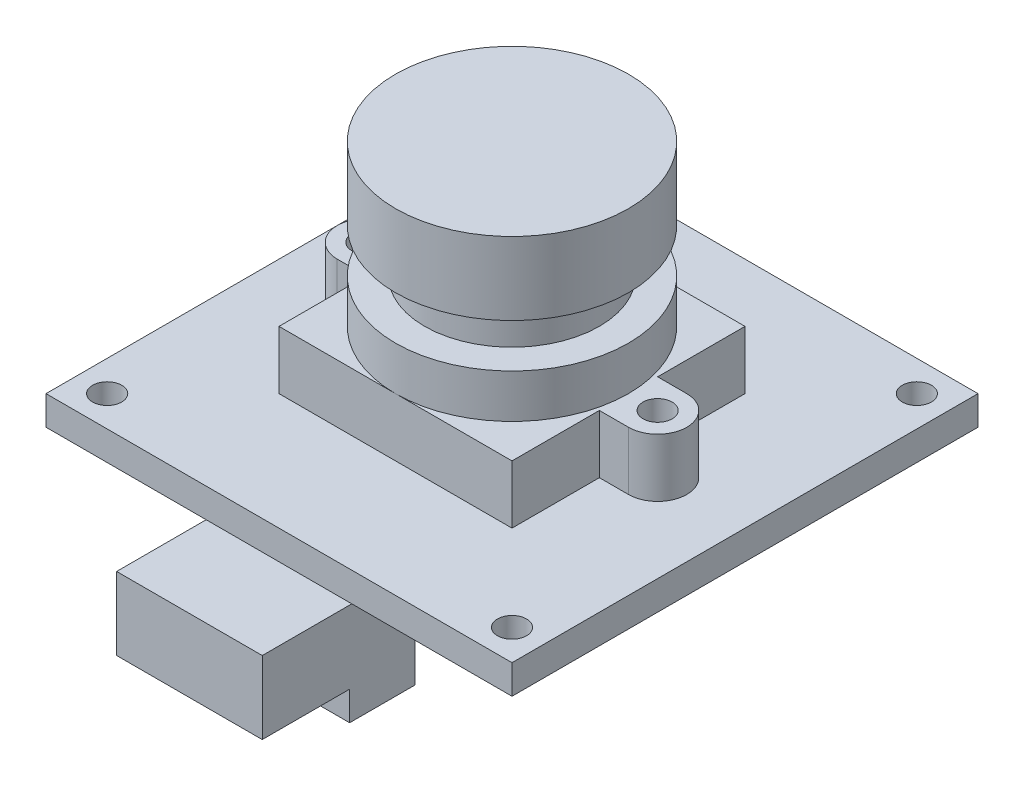
ISO-10303-21;
HEADER;
FILE_DESCRIPTION(('STEP AP214'),'2;1');
FILE_NAME('part.step','',(''),(''),'','','');
FILE_SCHEMA(('AUTOMOTIVE_DESIGN { 1 0 10303 214 1 1 1 1 }'));
ENDSEC;
DATA;
#1=APPLICATION_CONTEXT('core data for automotive mechanical design processes');
#2=APPLICATION_PROTOCOL_DEFINITION('international standard','automotive_design',2000,#1);
#3=PRODUCT_CONTEXT('',#1,'mechanical');
#4=PRODUCT('Part','Part','',(#3));
#5=PRODUCT_RELATED_PRODUCT_CATEGORY('part','',(#4));
#6=PRODUCT_DEFINITION_FORMATION('','',#4);
#7=PRODUCT_DEFINITION_CONTEXT('part definition',#1,'design');
#8=PRODUCT_DEFINITION('design','',#6,#7);
#9=PRODUCT_DEFINITION_SHAPE('','',#8);
#10=(LENGTH_UNIT() NAMED_UNIT(*) SI_UNIT(.MILLI.,.METRE.));
#11=(NAMED_UNIT(*) PLANE_ANGLE_UNIT() SI_UNIT($,.RADIAN.));
#12=(NAMED_UNIT(*) SI_UNIT($,.STERADIAN.) SOLID_ANGLE_UNIT());
#13=UNCERTAINTY_MEASURE_WITH_UNIT(LENGTH_MEASURE(1.E-05),#10,'distance_accuracy_value','');
#14=(GEOMETRIC_REPRESENTATION_CONTEXT(3) GLOBAL_UNCERTAINTY_ASSIGNED_CONTEXT((#13)) GLOBAL_UNIT_ASSIGNED_CONTEXT((#10,
#11,#12)) REPRESENTATION_CONTEXT('',''));
#15=CARTESIAN_POINT('',(0.,0.,0.));
#16=DIRECTION('',(0.,0.,1.));
#17=DIRECTION('',(1.,0.,0.));
#18=AXIS2_PLACEMENT_3D('',#15,#16,#17);
#19=CARTESIAN_POINT('',(-5.,-7.,16.15));
#20=DIRECTION('',(0.,0.,-1.));
#21=DIRECTION('',(-1.,0.,0.));
#22=AXIS2_PLACEMENT_3D('',#19,#20,#21);
#23=PLANE('',#22);
#24=DIRECTION('',(1.,0.,0.));
#25=VECTOR('',#24,1.);
#26=CARTESIAN_POINT('',(-5.,-5.,16.15));
#27=LINE('',#26,#25);
#28=CARTESIAN_POINT('',(-5.,-5.,16.15));
#29=VERTEX_POINT('',#28);
#30=CARTESIAN_POINT('',(5.,-5.,16.15));
#31=VERTEX_POINT('',#30);
#32=EDGE_CURVE('E63',#29,#31,#27,.T.);
#33=ORIENTED_EDGE('',*,*,#32,.F.);
#34=DIRECTION('',(0.,1.,0.));
#35=VECTOR('',#34,1.);
#36=CARTESIAN_POINT('',(-5.,-7.,16.15));
#37=LINE('',#36,#35);
#38=CARTESIAN_POINT('',(-5.,-7.,16.15));
#39=VERTEX_POINT('',#38);
#40=EDGE_CURVE('E232',#39,#29,#37,.T.);
#41=ORIENTED_EDGE('',*,*,#40,.F.);
#42=DIRECTION('',(-1.,0.,0.));
#43=VECTOR('',#42,1.);
#44=CARTESIAN_POINT('',(-5.,-7.,16.15));
#45=LINE('',#44,#43);
#46=CARTESIAN_POINT('',(5.,-7.,16.15));
#47=VERTEX_POINT('',#46);
#48=EDGE_CURVE('E245',#47,#39,#45,.T.);
#49=ORIENTED_EDGE('',*,*,#48,.F.);
#50=DIRECTION('',(0.,1.,0.));
#51=VECTOR('',#50,1.);
#52=CARTESIAN_POINT('',(5.,-7.,16.15));
#53=LINE('',#52,#51);
#54=EDGE_CURVE('E252',#47,#31,#53,.T.);
#55=ORIENTED_EDGE('',*,*,#54,.T.);
#56=EDGE_LOOP('',(#33,#41,#49,#55));
#57=FACE_BOUND('',#56,.T.);
#58=ADVANCED_FACE('F45',(#57),#23,.F.);
#59=CARTESIAN_POINT('',(0.,9.,0.));
#60=DIRECTION('',(0.,1.,0.));
#61=DIRECTION('',(0.,0.,1.));
#62=AXIS2_PLACEMENT_3D('',#59,#60,#61);
#63=PLANE('',#62);
#64=CARTESIAN_POINT('',(0.,9.,0.));
#65=DIRECTION('',(0.,1.,0.));
#66=DIRECTION('',(0.,0.,1.));
#67=AXIS2_PLACEMENT_3D('',#64,#65,#66);
#68=CIRCLE('',#67,8.);
#69=CARTESIAN_POINT('',(0.,9.,8.));
#70=VERTEX_POINT('',#69);
#71=EDGE_CURVE('E273',#70,#70,#68,.T.);
#72=ORIENTED_EDGE('',*,*,#71,.T.);
#73=EDGE_LOOP('',(#72));
#74=FACE_BOUND('',#73,.T.);
#75=CARTESIAN_POINT('',(0.,9.,0.));
#76=DIRECTION('',(0.,1.,0.));
#77=DIRECTION('',(0.,0.,1.));
#78=AXIS2_PLACEMENT_3D('',#75,#76,#77);
#79=CIRCLE('',#78,6.);
#80=CARTESIAN_POINT('',(0.,9.,6.));
#81=VERTEX_POINT('',#80);
#82=EDGE_CURVE('E264',#81,#81,#79,.T.);
#83=ORIENTED_EDGE('',*,*,#82,.F.);
#84=EDGE_LOOP('',(#83));
#85=FACE_BOUND('',#84,.T.);
#86=ADVANCED_FACE('F521',(#74,#85),#63,.T.);
#87=CARTESIAN_POINT('',(-10.,6.,0.));
#88=DIRECTION('',(0.,1.,0.));
#89=DIRECTION('',(0.,0.,1.));
#90=AXIS2_PLACEMENT_3D('',#87,#88,#89);
#91=PLANE('',#90);
#92=CARTESIAN_POINT('',(0.,6.,0.));
#93=DIRECTION('',(0.,1.,0.));
#94=DIRECTION('',(0.,0.,1.));
#95=AXIS2_PLACEMENT_3D('',#92,#93,#94);
#96=CIRCLE('',#95,8.);
#97=CARTESIAN_POINT('',(0.,6.,8.));
#98=VERTEX_POINT('',#97);
#99=CARTESIAN_POINT('',(0.,6.,-8.));
#100=VERTEX_POINT('',#99);
#101=EDGE_CURVE('E270',#98,#100,#96,.T.);
#102=ORIENTED_EDGE('',*,*,#101,.F.);
#103=DIRECTION('',(1.,0.,0.));
#104=VECTOR('',#103,1.);
#105=CARTESIAN_POINT('',(-8.,6.,8.));
#106=LINE('',#105,#104);
#107=CARTESIAN_POINT('',(8.,6.,8.));
#108=VERTEX_POINT('',#107);
#109=EDGE_CURVE('E309',#98,#108,#106,.T.);
#110=ORIENTED_EDGE('',*,*,#109,.T.);
#111=DIRECTION('',(0.,0.,-1.));
#112=VECTOR('',#111,1.);
#113=CARTESIAN_POINT('',(8.,6.,8.));
#114=LINE('',#113,#112);
#115=CARTESIAN_POINT('',(8.,6.,2.));
#116=VERTEX_POINT('',#115);
#117=EDGE_CURVE('E312',#108,#116,#114,.T.);
#118=ORIENTED_EDGE('',*,*,#117,.T.);
#119=DIRECTION('',(1.,0.,0.));
#120=VECTOR('',#119,1.);
#121=CARTESIAN_POINT('',(10.,6.,2.));
#122=LINE('',#121,#120);
#123=CARTESIAN_POINT('',(10.,6.,2.));
#124=VERTEX_POINT('',#123);
#125=EDGE_CURVE('E314',#116,#124,#122,.T.);
#126=ORIENTED_EDGE('',*,*,#125,.T.);
#127=CARTESIAN_POINT('',(10.,6.,0.));
#128=DIRECTION('',(0.,1.,0.));
#129=DIRECTION('',(0.,0.,1.));
#130=AXIS2_PLACEMENT_3D('',#127,#128,#129);
#131=CIRCLE('',#130,2.);
#132=CARTESIAN_POINT('',(10.,6.,-2.));
#133=VERTEX_POINT('',#132);
#134=EDGE_CURVE('E316',#124,#133,#131,.T.);
#135=ORIENTED_EDGE('',*,*,#134,.T.);
#136=DIRECTION('',(-1.,0.,0.));
#137=VECTOR('',#136,1.);
#138=CARTESIAN_POINT('',(10.,6.,-2.));
#139=LINE('',#138,#137);
#140=CARTESIAN_POINT('',(8.,6.,-2.));
#141=VERTEX_POINT('',#140);
#142=EDGE_CURVE('E318',#133,#141,#139,.T.);
#143=ORIENTED_EDGE('',*,*,#142,.T.);
#144=DIRECTION('',(0.,0.,-1.));
#145=VECTOR('',#144,1.);
#146=CARTESIAN_POINT('',(8.,6.,-2.));
#147=LINE('',#146,#145);
#148=CARTESIAN_POINT('',(8.,6.,-8.));
#149=VERTEX_POINT('',#148);
#150=EDGE_CURVE('E291',#141,#149,#147,.T.);
#151=ORIENTED_EDGE('',*,*,#150,.T.);
#152=DIRECTION('',(-1.,0.,0.));
#153=VECTOR('',#152,1.);
#154=CARTESIAN_POINT('',(-8.,6.,-8.));
#155=LINE('',#154,#153);
#156=EDGE_CURVE('E296',#149,#100,#155,.T.);
#157=ORIENTED_EDGE('',*,*,#156,.T.);
#158=EDGE_LOOP('',(#102,#110,#118,#126,#135,#143,#151,#157));
#159=FACE_BOUND('',#158,.T.);
#160=CARTESIAN_POINT('',(10.,6.,0.));
#161=DIRECTION('',(0.,1.,0.));
#162=DIRECTION('',(0.,0.,1.));
#163=AXIS2_PLACEMENT_3D('',#160,#161,#162);
#164=CIRCLE('',#163,1.);
#165=CARTESIAN_POINT('',(10.,6.,0.999999999999997));
#166=VERTEX_POINT('',#165);
#167=EDGE_CURVE('E285',#166,#166,#164,.T.);
#168=ORIENTED_EDGE('',*,*,#167,.F.);
#169=EDGE_LOOP('',(#168));
#170=FACE_BOUND('',#169,.T.);
#171=ADVANCED_FACE('F464',(#159,#170),#91,.T.);
#172=CARTESIAN_POINT('',(0.,2.,0.));
#173=DIRECTION('',(0.,-1.,0.));
#174=DIRECTION('',(0.,0.,-1.));
#175=AXIS2_PLACEMENT_3D('',#172,#173,#174);
#176=PLANE('',#175);
#177=CARTESIAN_POINT('',(13.9,2.,13.9));
#178=DIRECTION('',(0.,1.,0.));
#179=DIRECTION('',(0.,0.,1.));
#180=AXIS2_PLACEMENT_3D('',#177,#178,#179);
#181=CIRCLE('',#180,1.);
#182=CARTESIAN_POINT('',(13.9,2.,14.9));
#183=VERTEX_POINT('',#182);
#184=EDGE_CURVE('E391',#183,#183,#181,.T.);
#185=ORIENTED_EDGE('',*,*,#184,.F.);
#186=EDGE_LOOP('',(#185));
#187=FACE_BOUND('',#186,.T.);
#188=CARTESIAN_POINT('',(-13.9,2.,13.9));
#189=DIRECTION('',(0.,1.,0.));
#190=DIRECTION('',(0.,0.,1.));
#191=AXIS2_PLACEMENT_3D('',#188,#189,#190);
#192=CIRCLE('',#191,1.);
#193=CARTESIAN_POINT('',(-13.9,2.,14.9));
#194=VERTEX_POINT('',#193);
#195=EDGE_CURVE('E397',#194,#194,#192,.T.);
#196=ORIENTED_EDGE('',*,*,#195,.F.);
#197=EDGE_LOOP('',(#196));
#198=FACE_BOUND('',#197,.T.);
#199=CARTESIAN_POINT('',(13.9,2.,-13.9));
#200=DIRECTION('',(0.,1.,0.));
#201=DIRECTION('',(0.,0.,1.));
#202=AXIS2_PLACEMENT_3D('',#199,#200,#201);
#203=CIRCLE('',#202,1.);
#204=CARTESIAN_POINT('',(13.9,2.,-12.9));
#205=VERTEX_POINT('',#204);
#206=EDGE_CURVE('E403',#205,#205,#203,.T.);
#207=ORIENTED_EDGE('',*,*,#206,.F.);
#208=EDGE_LOOP('',(#207));
#209=FACE_BOUND('',#208,.T.);
#210=CARTESIAN_POINT('',(-13.9,2.,-13.9));
#211=DIRECTION('',(0.,1.,0.));
#212=DIRECTION('',(0.,0.,1.));
#213=AXIS2_PLACEMENT_3D('',#210,#211,#212);
#214=CIRCLE('',#213,1.);
#215=CARTESIAN_POINT('',(-13.9,2.,-12.9));
#216=VERTEX_POINT('',#215);
#217=EDGE_CURVE('E409',#216,#216,#214,.T.);
#218=ORIENTED_EDGE('',*,*,#217,.F.);
#219=EDGE_LOOP('',(#218));
#220=FACE_BOUND('',#219,.T.);
#221=DIRECTION('',(0.,0.,1.));
#222=VECTOR('',#221,1.);
#223=CARTESIAN_POINT('',(-16.,2.,16.));
#224=LINE('',#223,#222);
#225=CARTESIAN_POINT('',(-16.,2.,-16.));
#226=VERTEX_POINT('',#225);
#227=CARTESIAN_POINT('',(-16.,2.,16.));
#228=VERTEX_POINT('',#227);
#229=EDGE_CURVE('E415',#226,#228,#224,.T.);
#230=ORIENTED_EDGE('',*,*,#229,.T.);
#231=DIRECTION('',(1.,0.,0.));
#232=VECTOR('',#231,1.);
#233=CARTESIAN_POINT('',(-16.,2.,16.));
#234=LINE('',#233,#232);
#235=CARTESIAN_POINT('',(16.,2.,16.));
#236=VERTEX_POINT('',#235);
#237=EDGE_CURVE('E418',#228,#236,#234,.T.);
#238=ORIENTED_EDGE('',*,*,#237,.T.);
#239=DIRECTION('',(0.,0.,-1.));
#240=VECTOR('',#239,1.);
#241=CARTESIAN_POINT('',(16.,2.,16.));
#242=LINE('',#241,#240);
#243=CARTESIAN_POINT('',(16.,2.,-16.));
#244=VERTEX_POINT('',#243);
#245=EDGE_CURVE('E421',#236,#244,#242,.T.);
#246=ORIENTED_EDGE('',*,*,#245,.T.);
#247=DIRECTION('',(-1.,0.,0.));
#248=VECTOR('',#247,1.);
#249=CARTESIAN_POINT('',(-16.,2.,-16.));
#250=LINE('',#249,#248);
#251=EDGE_CURVE('E423',#244,#226,#250,.T.);
#252=ORIENTED_EDGE('',*,*,#251,.T.);
#253=EDGE_LOOP('',(#230,#238,#246,#252));
#254=FACE_BOUND('',#253,.T.);
#255=DIRECTION('',(0.,0.,-1.));
#256=VECTOR('',#255,1.);
#257=CARTESIAN_POINT('',(8.,2.,-2.));
#258=LINE('',#257,#256);
#259=CARTESIAN_POINT('',(8.,2.,-2.));
#260=VERTEX_POINT('',#259);
#261=CARTESIAN_POINT('',(8.,2.,-8.));
#262=VERTEX_POINT('',#261);
#263=EDGE_CURVE('E288',#260,#262,#258,.T.);
#264=ORIENTED_EDGE('',*,*,#263,.F.);
#265=DIRECTION('',(-1.,0.,0.));
#266=VECTOR('',#265,1.);
#267=CARTESIAN_POINT('',(10.,2.,-2.));
#268=LINE('',#267,#266);
#269=CARTESIAN_POINT('',(10.,2.,-2.));
#270=VERTEX_POINT('',#269);
#271=EDGE_CURVE('E295',#270,#260,#268,.T.);
#272=ORIENTED_EDGE('',*,*,#271,.F.);
#273=CARTESIAN_POINT('',(10.,2.,0.));
#274=DIRECTION('',(0.,1.,0.));
#275=DIRECTION('',(0.,0.,1.));
#276=AXIS2_PLACEMENT_3D('',#273,#274,#275);
#277=CIRCLE('',#276,2.);
#278=CARTESIAN_POINT('',(10.,2.,2.));
#279=VERTEX_POINT('',#278);
#280=EDGE_CURVE('E350',#279,#270,#277,.T.);
#281=ORIENTED_EDGE('',*,*,#280,.F.);
#282=DIRECTION('',(1.,0.,0.));
#283=VECTOR('',#282,1.);
#284=CARTESIAN_POINT('',(10.,2.,2.));
#285=LINE('',#284,#283);
#286=CARTESIAN_POINT('',(8.,2.,2.));
#287=VERTEX_POINT('',#286);
#288=EDGE_CURVE('E347',#287,#279,#285,.T.);
#289=ORIENTED_EDGE('',*,*,#288,.F.);
#290=DIRECTION('',(0.,0.,-1.));
#291=VECTOR('',#290,1.);
#292=CARTESIAN_POINT('',(8.,2.,8.));
#293=LINE('',#292,#291);
#294=CARTESIAN_POINT('',(8.,2.,8.));
#295=VERTEX_POINT('',#294);
#296=EDGE_CURVE('E344',#295,#287,#293,.T.);
#297=ORIENTED_EDGE('',*,*,#296,.F.);
#298=DIRECTION('',(1.,0.,0.));
#299=VECTOR('',#298,1.);
#300=CARTESIAN_POINT('',(-8.,2.,8.));
#301=LINE('',#300,#299);
#302=CARTESIAN_POINT('',(-8.,2.,8.));
#303=VERTEX_POINT('',#302);
#304=EDGE_CURVE('E341',#303,#295,#301,.T.);
#305=ORIENTED_EDGE('',*,*,#304,.F.);
#306=DIRECTION('',(0.,0.,1.));
#307=VECTOR('',#306,1.);
#308=CARTESIAN_POINT('',(-8.,2.,8.));
#309=LINE('',#308,#307);
#310=CARTESIAN_POINT('',(-8.,2.,2.));
#311=VERTEX_POINT('',#310);
#312=EDGE_CURVE('E338',#311,#303,#309,.T.);
#313=ORIENTED_EDGE('',*,*,#312,.F.);
#314=DIRECTION('',(1.,0.,0.));
#315=VECTOR('',#314,1.);
#316=CARTESIAN_POINT('',(-8.,2.,2.));
#317=LINE('',#316,#315);
#318=CARTESIAN_POINT('',(-10.,2.,2.));
#319=VERTEX_POINT('',#318);
#320=EDGE_CURVE('E335',#319,#311,#317,.T.);
#321=ORIENTED_EDGE('',*,*,#320,.F.);
#322=CARTESIAN_POINT('',(-10.,2.,0.));
#323=DIRECTION('',(0.,1.,0.));
#324=DIRECTION('',(0.,0.,1.));
#325=AXIS2_PLACEMENT_3D('',#322,#323,#324);
#326=CIRCLE('',#325,2.);
#327=CARTESIAN_POINT('',(-10.,2.,-2.));
#328=VERTEX_POINT('',#327);
#329=EDGE_CURVE('E332',#328,#319,#326,.T.);
#330=ORIENTED_EDGE('',*,*,#329,.F.);
#331=DIRECTION('',(-1.,0.,0.));
#332=VECTOR('',#331,1.);
#333=CARTESIAN_POINT('',(-8.,2.,-2.));
#334=LINE('',#333,#332);
#335=CARTESIAN_POINT('',(-8.,2.,-2.));
#336=VERTEX_POINT('',#335);
#337=EDGE_CURVE('E329',#336,#328,#334,.T.);
#338=ORIENTED_EDGE('',*,*,#337,.F.);
#339=DIRECTION('',(0.,0.,1.));
#340=VECTOR('',#339,1.);
#341=CARTESIAN_POINT('',(-8.,2.,-2.));
#342=LINE('',#341,#340);
#343=CARTESIAN_POINT('',(-8.,2.,-8.));
#344=VERTEX_POINT('',#343);
#345=EDGE_CURVE('E326',#344,#336,#342,.T.);
#346=ORIENTED_EDGE('',*,*,#345,.F.);
#347=DIRECTION('',(-1.,0.,0.));
#348=VECTOR('',#347,1.);
#349=CARTESIAN_POINT('',(-8.,2.,-8.));
#350=LINE('',#349,#348);
#351=EDGE_CURVE('E323',#262,#344,#350,.T.);
#352=ORIENTED_EDGE('',*,*,#351,.F.);
#353=EDGE_LOOP('',(#264,#272,#281,#289,#297,#305,#313,#321,#330,#338,#346,#352));
#354=FACE_BOUND('',#353,.T.);
#355=ADVANCED_FACE('F509',(#187,#198,#209,#220,#254,#354),#176,.F.);
#356=CARTESIAN_POINT('',(0.,0.,0.));
#357=DIRECTION('',(0.,-1.,0.));
#358=DIRECTION('',(0.,0.,-1.));
#359=AXIS2_PLACEMENT_3D('',#356,#357,#358);
#360=PLANE('',#359);
#361=DIRECTION('',(0.,0.,-1.));
#362=VECTOR('',#361,1.);
#363=CARTESIAN_POINT('',(-5.,0.,16.15));
#364=LINE('',#363,#362);
#365=CARTESIAN_POINT('',(-5.,0.,16.));
#366=VERTEX_POINT('',#365);
#367=CARTESIAN_POINT('',(-5.,0.,11.65));
#368=VERTEX_POINT('',#367);
#369=EDGE_CURVE('E11',#366,#368,#364,.T.);
#370=ORIENTED_EDGE('',*,*,#369,.F.);
#371=DIRECTION('',(1.,0.,0.));
#372=VECTOR('',#371,1.);
#373=CARTESIAN_POINT('',(-16.,0.,16.));
#374=LINE('',#373,#372);
#375=CARTESIAN_POINT('',(-16.,0.,16.));
#376=VERTEX_POINT('',#375);
#377=EDGE_CURVE('E429',#376,#366,#374,.T.);
#378=ORIENTED_EDGE('',*,*,#377,.F.);
#379=DIRECTION('',(0.,0.,1.));
#380=VECTOR('',#379,1.);
#381=CARTESIAN_POINT('',(-16.,0.,16.));
#382=LINE('',#381,#380);
#383=CARTESIAN_POINT('',(-16.,0.,-16.));
#384=VERTEX_POINT('',#383);
#385=EDGE_CURVE('E412',#384,#376,#382,.T.);
#386=ORIENTED_EDGE('',*,*,#385,.F.);
#387=DIRECTION('',(-1.,0.,0.));
#388=VECTOR('',#387,1.);
#389=CARTESIAN_POINT('',(-16.,0.,-16.));
#390=LINE('',#389,#388);
#391=CARTESIAN_POINT('',(16.,0.,-16.));
#392=VERTEX_POINT('',#391);
#393=EDGE_CURVE('E419',#392,#384,#390,.T.);
#394=ORIENTED_EDGE('',*,*,#393,.F.);
#395=DIRECTION('',(0.,0.,-1.));
#396=VECTOR('',#395,1.);
#397=CARTESIAN_POINT('',(16.,0.,16.));
#398=LINE('',#397,#396);
#399=CARTESIAN_POINT('',(16.,0.,16.));
#400=VERTEX_POINT('',#399);
#401=EDGE_CURVE('E432',#400,#392,#398,.T.);
#402=ORIENTED_EDGE('',*,*,#401,.F.);
#403=CARTESIAN_POINT('',(5.,0.,16.));
#404=VERTEX_POINT('',#403);
#405=EDGE_CURVE('E428',#404,#400,#374,.T.);
#406=ORIENTED_EDGE('',*,*,#405,.F.);
#407=DIRECTION('',(0.,0.,1.));
#408=VECTOR('',#407,1.);
#409=CARTESIAN_POINT('',(5.,0.,16.15));
#410=LINE('',#409,#408);
#411=CARTESIAN_POINT('',(5.,0.,11.65));
#412=VERTEX_POINT('',#411);
#413=EDGE_CURVE('E241',#412,#404,#410,.T.);
#414=ORIENTED_EDGE('',*,*,#413,.F.);
#415=DIRECTION('',(1.,0.,0.));
#416=VECTOR('',#415,1.);
#417=CARTESIAN_POINT('',(-5.,0.,11.65));
#418=LINE('',#417,#416);
#419=EDGE_CURVE('E71',#368,#412,#418,.T.);
#420=ORIENTED_EDGE('',*,*,#419,.F.);
#421=EDGE_LOOP('',(#370,#378,#386,#394,#402,#406,#414,#420));
#422=FACE_BOUND('',#421,.T.);
#423=CARTESIAN_POINT('',(-13.9,0.,13.9));
#424=DIRECTION('',(0.,1.,0.));
#425=DIRECTION('',(0.,0.,1.));
#426=AXIS2_PLACEMENT_3D('',#423,#424,#425);
#427=CIRCLE('',#426,1.);
#428=CARTESIAN_POINT('',(-13.9,0.,14.9));
#429=VERTEX_POINT('',#428);
#430=EDGE_CURVE('E394',#429,#429,#427,.T.);
#431=ORIENTED_EDGE('',*,*,#430,.T.);
#432=EDGE_LOOP('',(#431));
#433=FACE_BOUND('',#432,.T.);
#434=CARTESIAN_POINT('',(-13.9,0.,-13.9));
#435=DIRECTION('',(0.,1.,0.));
#436=DIRECTION('',(0.,0.,1.));
#437=AXIS2_PLACEMENT_3D('',#434,#435,#436);
#438=CIRCLE('',#437,1.);
#439=CARTESIAN_POINT('',(-13.9,0.,-12.9));
#440=VERTEX_POINT('',#439);
#441=EDGE_CURVE('E406',#440,#440,#438,.T.);
#442=ORIENTED_EDGE('',*,*,#441,.T.);
#443=EDGE_LOOP('',(#442));
#444=FACE_BOUND('',#443,.T.);
#445=CARTESIAN_POINT('',(13.9,0.,-13.9));
#446=DIRECTION('',(0.,1.,0.));
#447=DIRECTION('',(0.,0.,1.));
#448=AXIS2_PLACEMENT_3D('',#445,#446,#447);
#449=CIRCLE('',#448,1.);
#450=CARTESIAN_POINT('',(13.9,0.,-12.9));
#451=VERTEX_POINT('',#450);
#452=EDGE_CURVE('E400',#451,#451,#449,.T.);
#453=ORIENTED_EDGE('',*,*,#452,.T.);
#454=EDGE_LOOP('',(#453));
#455=FACE_BOUND('',#454,.T.);
#456=CARTESIAN_POINT('',(13.9,0.,13.9));
#457=DIRECTION('',(0.,1.,0.));
#458=DIRECTION('',(0.,0.,1.));
#459=AXIS2_PLACEMENT_3D('',#456,#457,#458);
#460=CIRCLE('',#459,1.);
#461=CARTESIAN_POINT('',(13.9,0.,14.9));
#462=VERTEX_POINT('',#461);
#463=EDGE_CURVE('E390',#462,#462,#460,.T.);
#464=ORIENTED_EDGE('',*,*,#463,.T.);
#465=EDGE_LOOP('',(#464));
#466=FACE_BOUND('',#465,.T.);
#467=ADVANCED_FACE('F511',(#422,#433,#444,#455,#466),#360,.T.);
#468=CARTESIAN_POINT('',(-16.,2.,16.));
#469=DIRECTION('',(1.,0.,0.));
#470=DIRECTION('',(0.,0.,-1.));
#471=AXIS2_PLACEMENT_3D('',#468,#469,#470);
#472=PLANE('',#471);
#473=ORIENTED_EDGE('',*,*,#385,.T.);
#474=DIRECTION('',(0.,-1.,0.));
#475=VECTOR('',#474,1.);
#476=CARTESIAN_POINT('',(-16.,2.,16.));
#477=LINE('',#476,#475);
#478=EDGE_CURVE('E49',#228,#376,#477,.T.);
#479=ORIENTED_EDGE('',*,*,#478,.F.);
#480=ORIENTED_EDGE('',*,*,#229,.F.);
#481=DIRECTION('',(0.,-1.,0.));
#482=VECTOR('',#481,1.);
#483=CARTESIAN_POINT('',(-16.,2.,-16.));
#484=LINE('',#483,#482);
#485=EDGE_CURVE('E425',#226,#384,#484,.T.);
#486=ORIENTED_EDGE('',*,*,#485,.T.);
#487=EDGE_LOOP('',(#473,#479,#480,#486));
#488=FACE_BOUND('',#487,.T.);
#489=ADVANCED_FACE('F47',(#488),#472,.F.);
#490=CARTESIAN_POINT('',(-16.,2.,16.));
#491=DIRECTION('',(0.,0.,-1.));
#492=DIRECTION('',(-1.,0.,0.));
#493=AXIS2_PLACEMENT_3D('',#490,#491,#492);
#494=PLANE('',#493);
#495=ORIENTED_EDGE('',*,*,#377,.T.);
#496=EDGE_CURVE('E433',#366,#404,#374,.T.);
#497=ORIENTED_EDGE('',*,*,#496,.T.);
#498=ORIENTED_EDGE('',*,*,#405,.T.);
#499=DIRECTION('',(0.,-1.,0.));
#500=VECTOR('',#499,1.);
#501=CARTESIAN_POINT('',(16.,2.,16.));
#502=LINE('',#501,#500);
#503=EDGE_CURVE('E440',#236,#400,#502,.T.);
#504=ORIENTED_EDGE('',*,*,#503,.F.);
#505=ORIENTED_EDGE('',*,*,#237,.F.);
#506=ORIENTED_EDGE('',*,*,#478,.T.);
#507=EDGE_LOOP('',(#495,#497,#498,#504,#505,#506));
#508=FACE_BOUND('',#507,.T.);
#509=ADVANCED_FACE('F648',(#508),#494,.F.);
#510=CARTESIAN_POINT('',(16.,2.,16.));
#511=DIRECTION('',(-1.,0.,0.));
#512=DIRECTION('',(0.,0.,1.));
#513=AXIS2_PLACEMENT_3D('',#510,#511,#512);
#514=PLANE('',#513);
#515=ORIENTED_EDGE('',*,*,#401,.T.);
#516=DIRECTION('',(0.,-1.,0.));
#517=VECTOR('',#516,1.);
#518=CARTESIAN_POINT('',(16.,2.,-16.));
#519=LINE('',#518,#517);
#520=EDGE_CURVE('E438',#244,#392,#519,.T.);
#521=ORIENTED_EDGE('',*,*,#520,.F.);
#522=ORIENTED_EDGE('',*,*,#245,.F.);
#523=ORIENTED_EDGE('',*,*,#503,.T.);
#524=EDGE_LOOP('',(#515,#521,#522,#523));
#525=FACE_BOUND('',#524,.T.);
#526=ADVANCED_FACE('F624',(#525),#514,.F.);
#527=CARTESIAN_POINT('',(-16.,2.,-16.));
#528=DIRECTION('',(0.,0.,1.));
#529=DIRECTION('',(1.,0.,0.));
#530=AXIS2_PLACEMENT_3D('',#527,#528,#529);
#531=PLANE('',#530);
#532=ORIENTED_EDGE('',*,*,#393,.T.);
#533=ORIENTED_EDGE('',*,*,#485,.F.);
#534=ORIENTED_EDGE('',*,*,#251,.F.);
#535=ORIENTED_EDGE('',*,*,#520,.T.);
#536=EDGE_LOOP('',(#532,#533,#534,#535));
#537=FACE_BOUND('',#536,.T.);
#538=ADVANCED_FACE('F619',(#537),#531,.F.);
#539=CARTESIAN_POINT('',(-13.9,2.,-13.9));
#540=DIRECTION('',(0.,-1.,0.));
#541=DIRECTION('',(0.,0.,-1.));
#542=AXIS2_PLACEMENT_3D('',#539,#540,#541);
#543=CYLINDRICAL_SURFACE('',#542,1.);
#544=ORIENTED_EDGE('',*,*,#217,.T.);
#545=EDGE_LOOP('',(#544));
#546=FACE_BOUND('',#545,.T.);
#547=ORIENTED_EDGE('',*,*,#441,.F.);
#548=EDGE_LOOP('',(#547));
#549=FACE_BOUND('',#548,.T.);
#550=ADVANCED_FACE('F616',(#546,#549),#543,.F.);
#551=CARTESIAN_POINT('',(13.9,2.,-13.9));
#552=DIRECTION('',(0.,-1.,0.));
#553=DIRECTION('',(0.,0.,-1.));
#554=AXIS2_PLACEMENT_3D('',#551,#552,#553);
#555=CYLINDRICAL_SURFACE('',#554,1.);
#556=ORIENTED_EDGE('',*,*,#206,.T.);
#557=EDGE_LOOP('',(#556));
#558=FACE_BOUND('',#557,.T.);
#559=ORIENTED_EDGE('',*,*,#452,.F.);
#560=EDGE_LOOP('',(#559));
#561=FACE_BOUND('',#560,.T.);
#562=ADVANCED_FACE('F613',(#558,#561),#555,.F.);
#563=CARTESIAN_POINT('',(-13.9,2.,13.9));
#564=DIRECTION('',(0.,-1.,0.));
#565=DIRECTION('',(0.,0.,-1.));
#566=AXIS2_PLACEMENT_3D('',#563,#564,#565);
#567=CYLINDRICAL_SURFACE('',#566,1.);
#568=ORIENTED_EDGE('',*,*,#195,.T.);
#569=EDGE_LOOP('',(#568));
#570=FACE_BOUND('',#569,.T.);
#571=ORIENTED_EDGE('',*,*,#430,.F.);
#572=EDGE_LOOP('',(#571));
#573=FACE_BOUND('',#572,.T.);
#574=ADVANCED_FACE('F609',(#570,#573),#567,.F.);
#575=CARTESIAN_POINT('',(13.9,2.,13.9));
#576=DIRECTION('',(0.,-1.,0.));
#577=DIRECTION('',(0.,0.,-1.));
#578=AXIS2_PLACEMENT_3D('',#575,#576,#577);
#579=CYLINDRICAL_SURFACE('',#578,1.);
#580=ORIENTED_EDGE('',*,*,#184,.T.);
#581=EDGE_LOOP('',(#580));
#582=FACE_BOUND('',#581,.T.);
#583=ORIENTED_EDGE('',*,*,#463,.F.);
#584=EDGE_LOOP('',(#583));
#585=FACE_BOUND('',#584,.T.);
#586=ADVANCED_FACE('F582',(#582,#585),#579,.F.);
#587=EDGE_CURVE('E54',#100,#98,#96,.T.);
#588=ORIENTED_EDGE('',*,*,#587,.F.);
#589=CARTESIAN_POINT('',(-8.,6.,-8.));
#590=VERTEX_POINT('',#589);
#591=EDGE_CURVE('E294',#100,#590,#155,.T.);
#592=ORIENTED_EDGE('',*,*,#591,.T.);
#593=DIRECTION('',(0.,0.,1.));
#594=VECTOR('',#593,1.);
#595=CARTESIAN_POINT('',(-8.,6.,-2.));
#596=LINE('',#595,#594);
#597=CARTESIAN_POINT('',(-8.,6.,-2.));
#598=VERTEX_POINT('',#597);
#599=EDGE_CURVE('E299',#590,#598,#596,.T.);
#600=ORIENTED_EDGE('',*,*,#599,.T.);
#601=DIRECTION('',(-1.,0.,0.));
#602=VECTOR('',#601,1.);
#603=CARTESIAN_POINT('',(-8.,6.,-2.));
#604=LINE('',#603,#602);
#605=CARTESIAN_POINT('',(-10.,6.,-2.));
#606=VERTEX_POINT('',#605);
#607=EDGE_CURVE('E301',#598,#606,#604,.T.);
#608=ORIENTED_EDGE('',*,*,#607,.T.);
#609=CARTESIAN_POINT('',(-10.,6.,0.));
#610=DIRECTION('',(0.,1.,0.));
#611=DIRECTION('',(0.,0.,1.));
#612=AXIS2_PLACEMENT_3D('',#609,#610,#611);
#613=CIRCLE('',#612,2.);
#614=CARTESIAN_POINT('',(-10.,6.,2.));
#615=VERTEX_POINT('',#614);
#616=EDGE_CURVE('E303',#606,#615,#613,.T.);
#617=ORIENTED_EDGE('',*,*,#616,.T.);
#618=DIRECTION('',(1.,0.,0.));
#619=VECTOR('',#618,1.);
#620=CARTESIAN_POINT('',(-8.,6.,2.));
#621=LINE('',#620,#619);
#622=CARTESIAN_POINT('',(-8.,6.,2.));
#623=VERTEX_POINT('',#622);
#624=EDGE_CURVE('E305',#615,#623,#621,.T.);
#625=ORIENTED_EDGE('',*,*,#624,.T.);
#626=DIRECTION('',(0.,0.,1.));
#627=VECTOR('',#626,1.);
#628=CARTESIAN_POINT('',(-8.,6.,8.));
#629=LINE('',#628,#627);
#630=CARTESIAN_POINT('',(-8.,6.,8.));
#631=VERTEX_POINT('',#630);
#632=EDGE_CURVE('E307',#623,#631,#629,.T.);
#633=ORIENTED_EDGE('',*,*,#632,.T.);
#634=EDGE_CURVE('E310',#631,#98,#106,.T.);
#635=ORIENTED_EDGE('',*,*,#634,.T.);
#636=EDGE_LOOP('',(#588,#592,#600,#608,#617,#625,#633,#635));
#637=FACE_BOUND('',#636,.T.);
#638=CARTESIAN_POINT('',(-10.,6.,0.));
#639=DIRECTION('',(0.,1.,0.));
#640=DIRECTION('',(0.,0.,1.));
#641=AXIS2_PLACEMENT_3D('',#638,#639,#640);
#642=CIRCLE('',#641,1.);
#643=CARTESIAN_POINT('',(-10.,6.,1.));
#644=VERTEX_POINT('',#643);
#645=EDGE_CURVE('E279',#644,#644,#642,.T.);
#646=ORIENTED_EDGE('',*,*,#645,.F.);
#647=EDGE_LOOP('',(#646));
#648=FACE_BOUND('',#647,.T.);
#649=ADVANCED_FACE('F455',(#637,#648),#91,.T.);
#650=CARTESIAN_POINT('',(8.,6.,-2.));
#651=DIRECTION('',(-1.,0.,0.));
#652=DIRECTION('',(0.,0.,1.));
#653=AXIS2_PLACEMENT_3D('',#650,#651,#652);
#654=PLANE('',#653);
#655=ORIENTED_EDGE('',*,*,#263,.T.);
#656=DIRECTION('',(0.,-1.,0.));
#657=VECTOR('',#656,1.);
#658=CARTESIAN_POINT('',(8.,6.,-8.));
#659=LINE('',#658,#657);
#660=EDGE_CURVE('E387',#149,#262,#659,.T.);
#661=ORIENTED_EDGE('',*,*,#660,.F.);
#662=ORIENTED_EDGE('',*,*,#150,.F.);
#663=DIRECTION('',(0.,-1.,0.));
#664=VECTOR('',#663,1.);
#665=CARTESIAN_POINT('',(8.,6.,-2.));
#666=LINE('',#665,#664);
#667=EDGE_CURVE('E320',#141,#260,#666,.T.);
#668=ORIENTED_EDGE('',*,*,#667,.T.);
#669=EDGE_LOOP('',(#655,#661,#662,#668));
#670=FACE_BOUND('',#669,.T.);
#671=ADVANCED_FACE('F471',(#670),#654,.F.);
#672=CARTESIAN_POINT('',(-8.,6.,-8.));
#673=DIRECTION('',(0.,0.,1.));
#674=DIRECTION('',(1.,0.,0.));
#675=AXIS2_PLACEMENT_3D('',#672,#673,#674);
#676=PLANE('',#675);
#677=ORIENTED_EDGE('',*,*,#351,.T.);
#678=DIRECTION('',(0.,-1.,0.));
#679=VECTOR('',#678,1.);
#680=CARTESIAN_POINT('',(-8.,6.,-8.));
#681=LINE('',#680,#679);
#682=EDGE_CURVE('E384',#590,#344,#681,.T.);
#683=ORIENTED_EDGE('',*,*,#682,.F.);
#684=ORIENTED_EDGE('',*,*,#591,.F.);
#685=ORIENTED_EDGE('',*,*,#156,.F.);
#686=ORIENTED_EDGE('',*,*,#660,.T.);
#687=EDGE_LOOP('',(#677,#683,#684,#685,#686));
#688=FACE_BOUND('',#687,.T.);
#689=ADVANCED_FACE('F461',(#688),#676,.F.);
#690=CARTESIAN_POINT('',(-8.,6.,-2.));
#691=DIRECTION('',(1.,0.,0.));
#692=DIRECTION('',(0.,0.,-1.));
#693=AXIS2_PLACEMENT_3D('',#690,#691,#692);
#694=PLANE('',#693);
#695=ORIENTED_EDGE('',*,*,#345,.T.);
#696=DIRECTION('',(0.,-1.,0.));
#697=VECTOR('',#696,1.);
#698=CARTESIAN_POINT('',(-8.,6.,-2.));
#699=LINE('',#698,#697);
#700=EDGE_CURVE('E381',#598,#336,#699,.T.);
#701=ORIENTED_EDGE('',*,*,#700,.F.);
#702=ORIENTED_EDGE('',*,*,#599,.F.);
#703=ORIENTED_EDGE('',*,*,#682,.T.);
#704=EDGE_LOOP('',(#695,#701,#702,#703));
#705=FACE_BOUND('',#704,.T.);
#706=ADVANCED_FACE('F474',(#705),#694,.F.);
#707=CARTESIAN_POINT('',(-8.,6.,-2.));
#708=DIRECTION('',(0.,0.,1.));
#709=DIRECTION('',(1.,0.,0.));
#710=AXIS2_PLACEMENT_3D('',#707,#708,#709);
#711=PLANE('',#710);
#712=ORIENTED_EDGE('',*,*,#337,.T.);
#713=DIRECTION('',(0.,-1.,0.));
#714=VECTOR('',#713,1.);
#715=CARTESIAN_POINT('',(-10.,6.,-2.));
#716=LINE('',#715,#714);
#717=EDGE_CURVE('E378',#606,#328,#716,.T.);
#718=ORIENTED_EDGE('',*,*,#717,.F.);
#719=ORIENTED_EDGE('',*,*,#607,.F.);
#720=ORIENTED_EDGE('',*,*,#700,.T.);
#721=EDGE_LOOP('',(#712,#718,#719,#720));
#722=FACE_BOUND('',#721,.T.);
#723=ADVANCED_FACE('F481',(#722),#711,.F.);
#724=CARTESIAN_POINT('',(-10.,6.,0.));
#725=DIRECTION('',(0.,-1.,0.));
#726=DIRECTION('',(0.,0.,-1.));
#727=AXIS2_PLACEMENT_3D('',#724,#725,#726);
#728=CYLINDRICAL_SURFACE('',#727,2.);
#729=ORIENTED_EDGE('',*,*,#329,.T.);
#730=DIRECTION('',(0.,-1.,0.));
#731=VECTOR('',#730,1.);
#732=CARTESIAN_POINT('',(-10.,6.,2.));
#733=LINE('',#732,#731);
#734=EDGE_CURVE('E375',#615,#319,#733,.T.);
#735=ORIENTED_EDGE('',*,*,#734,.F.);
#736=ORIENTED_EDGE('',*,*,#616,.F.);
#737=ORIENTED_EDGE('',*,*,#717,.T.);
#738=EDGE_LOOP('',(#729,#735,#736,#737));
#739=FACE_BOUND('',#738,.T.);
#740=ADVANCED_FACE('F483',(#739),#728,.T.);
#741=CARTESIAN_POINT('',(-8.,6.,2.));
#742=DIRECTION('',(0.,0.,-1.));
#743=DIRECTION('',(-1.,0.,0.));
#744=AXIS2_PLACEMENT_3D('',#741,#742,#743);
#745=PLANE('',#744);
#746=ORIENTED_EDGE('',*,*,#320,.T.);
#747=DIRECTION('',(0.,-1.,0.));
#748=VECTOR('',#747,1.);
#749=CARTESIAN_POINT('',(-8.,6.,2.));
#750=LINE('',#749,#748);
#751=EDGE_CURVE('E372',#623,#311,#750,.T.);
#752=ORIENTED_EDGE('',*,*,#751,.F.);
#753=ORIENTED_EDGE('',*,*,#624,.F.);
#754=ORIENTED_EDGE('',*,*,#734,.T.);
#755=EDGE_LOOP('',(#746,#752,#753,#754));
#756=FACE_BOUND('',#755,.T.);
#757=ADVANCED_FACE('F487',(#756),#745,.F.);
#758=CARTESIAN_POINT('',(-8.,6.,8.));
#759=DIRECTION('',(1.,0.,0.));
#760=DIRECTION('',(0.,0.,-1.));
#761=AXIS2_PLACEMENT_3D('',#758,#759,#760);
#762=PLANE('',#761);
#763=ORIENTED_EDGE('',*,*,#312,.T.);
#764=DIRECTION('',(0.,-1.,0.));
#765=VECTOR('',#764,1.);
#766=CARTESIAN_POINT('',(-8.,6.,8.));
#767=LINE('',#766,#765);
#768=EDGE_CURVE('E369',#631,#303,#767,.T.);
#769=ORIENTED_EDGE('',*,*,#768,.F.);
#770=ORIENTED_EDGE('',*,*,#632,.F.);
#771=ORIENTED_EDGE('',*,*,#751,.T.);
#772=EDGE_LOOP('',(#763,#769,#770,#771));
#773=FACE_BOUND('',#772,.T.);
#774=ADVANCED_FACE('F491',(#773),#762,.F.);
#775=CARTESIAN_POINT('',(-8.,6.,8.));
#776=DIRECTION('',(0.,0.,-1.));
#777=DIRECTION('',(-1.,0.,0.));
#778=AXIS2_PLACEMENT_3D('',#775,#776,#777);
#779=PLANE('',#778);
#780=ORIENTED_EDGE('',*,*,#304,.T.);
#781=DIRECTION('',(0.,-1.,0.));
#782=VECTOR('',#781,1.);
#783=CARTESIAN_POINT('',(8.,6.,8.));
#784=LINE('',#783,#782);
#785=EDGE_CURVE('E366',#108,#295,#784,.T.);
#786=ORIENTED_EDGE('',*,*,#785,.F.);
#787=ORIENTED_EDGE('',*,*,#109,.F.);
#788=ORIENTED_EDGE('',*,*,#634,.F.);
#789=ORIENTED_EDGE('',*,*,#768,.T.);
#790=EDGE_LOOP('',(#780,#786,#787,#788,#789));
#791=FACE_BOUND('',#790,.T.);
#792=ADVANCED_FACE('F493',(#791),#779,.F.);
#793=CARTESIAN_POINT('',(8.,6.,8.));
#794=DIRECTION('',(-1.,0.,0.));
#795=DIRECTION('',(0.,0.,1.));
#796=AXIS2_PLACEMENT_3D('',#793,#794,#795);
#797=PLANE('',#796);
#798=ORIENTED_EDGE('',*,*,#296,.T.);
#799=DIRECTION('',(0.,-1.,0.));
#800=VECTOR('',#799,1.);
#801=CARTESIAN_POINT('',(8.,6.,2.));
#802=LINE('',#801,#800);
#803=EDGE_CURVE('E363',#116,#287,#802,.T.);
#804=ORIENTED_EDGE('',*,*,#803,.F.);
#805=ORIENTED_EDGE('',*,*,#117,.F.);
#806=ORIENTED_EDGE('',*,*,#785,.T.);
#807=EDGE_LOOP('',(#798,#804,#805,#806));
#808=FACE_BOUND('',#807,.T.);
#809=ADVANCED_FACE('F500',(#808),#797,.F.);
#810=CARTESIAN_POINT('',(10.,6.,2.));
#811=DIRECTION('',(0.,0.,-1.));
#812=DIRECTION('',(-1.,0.,0.));
#813=AXIS2_PLACEMENT_3D('',#810,#811,#812);
#814=PLANE('',#813);
#815=ORIENTED_EDGE('',*,*,#288,.T.);
#816=DIRECTION('',(0.,-1.,0.));
#817=VECTOR('',#816,1.);
#818=CARTESIAN_POINT('',(10.,6.,2.));
#819=LINE('',#818,#817);
#820=EDGE_CURVE('E360',#124,#279,#819,.T.);
#821=ORIENTED_EDGE('',*,*,#820,.F.);
#822=ORIENTED_EDGE('',*,*,#125,.F.);
#823=ORIENTED_EDGE('',*,*,#803,.T.);
#824=EDGE_LOOP('',(#815,#821,#822,#823));
#825=FACE_BOUND('',#824,.T.);
#826=ADVANCED_FACE('F502',(#825),#814,.F.);
#827=CARTESIAN_POINT('',(10.,6.,0.));
#828=DIRECTION('',(0.,-1.,0.));
#829=DIRECTION('',(0.,0.,-1.));
#830=AXIS2_PLACEMENT_3D('',#827,#828,#829);
#831=CYLINDRICAL_SURFACE('',#830,2.);
#832=ORIENTED_EDGE('',*,*,#280,.T.);
#833=DIRECTION('',(0.,-1.,0.));
#834=VECTOR('',#833,1.);
#835=CARTESIAN_POINT('',(10.,6.,-2.));
#836=LINE('',#835,#834);
#837=EDGE_CURVE('E357',#133,#270,#836,.T.);
#838=ORIENTED_EDGE('',*,*,#837,.F.);
#839=ORIENTED_EDGE('',*,*,#134,.F.);
#840=ORIENTED_EDGE('',*,*,#820,.T.);
#841=EDGE_LOOP('',(#832,#838,#839,#840));
#842=FACE_BOUND('',#841,.T.);
#843=ADVANCED_FACE('F506',(#842),#831,.T.);
#844=CARTESIAN_POINT('',(10.,6.,-2.));
#845=DIRECTION('',(0.,0.,1.));
#846=DIRECTION('',(1.,0.,0.));
#847=AXIS2_PLACEMENT_3D('',#844,#845,#846);
#848=PLANE('',#847);
#849=ORIENTED_EDGE('',*,*,#271,.T.);
#850=ORIENTED_EDGE('',*,*,#667,.F.);
#851=ORIENTED_EDGE('',*,*,#142,.F.);
#852=ORIENTED_EDGE('',*,*,#837,.T.);
#853=EDGE_LOOP('',(#849,#850,#851,#852));
#854=FACE_BOUND('',#853,.T.);
#855=ADVANCED_FACE('F508',(#854),#848,.F.);
#856=CARTESIAN_POINT('',(10.,6.,0.));
#857=DIRECTION('',(0.,-1.,0.));
#858=DIRECTION('',(0.,0.,-1.));
#859=AXIS2_PLACEMENT_3D('',#856,#857,#858);
#860=CYLINDRICAL_SURFACE('',#859,1.);
#861=ORIENTED_EDGE('',*,*,#167,.T.);
#862=EDGE_LOOP('',(#861));
#863=FACE_BOUND('',#862,.T.);
#864=CARTESIAN_POINT('',(10.,2.,0.));
#865=DIRECTION('',(0.,1.,0.));
#866=DIRECTION('',(0.,0.,1.));
#867=AXIS2_PLACEMENT_3D('',#864,#865,#866);
#868=CIRCLE('',#867,1.);
#869=CARTESIAN_POINT('',(10.,2.,0.999999999999997));
#870=VERTEX_POINT('',#869);
#871=EDGE_CURVE('E282',#870,#870,#868,.T.);
#872=ORIENTED_EDGE('',*,*,#871,.F.);
#873=EDGE_LOOP('',(#872));
#874=FACE_BOUND('',#873,.T.);
#875=ADVANCED_FACE('F576',(#863,#874),#860,.F.);
#876=CARTESIAN_POINT('',(-10.,6.,0.));
#877=DIRECTION('',(0.,-1.,0.));
#878=DIRECTION('',(0.,0.,-1.));
#879=AXIS2_PLACEMENT_3D('',#876,#877,#878);
#880=CYLINDRICAL_SURFACE('',#879,1.);
#881=ORIENTED_EDGE('',*,*,#645,.T.);
#882=EDGE_LOOP('',(#881));
#883=FACE_BOUND('',#882,.T.);
#884=CARTESIAN_POINT('',(-10.,2.,0.));
#885=DIRECTION('',(0.,1.,0.));
#886=DIRECTION('',(0.,0.,1.));
#887=AXIS2_PLACEMENT_3D('',#884,#885,#886);
#888=CIRCLE('',#887,1.);
#889=CARTESIAN_POINT('',(-10.,2.,1.));
#890=VERTEX_POINT('',#889);
#891=EDGE_CURVE('E276',#890,#890,#888,.T.);
#892=ORIENTED_EDGE('',*,*,#891,.F.);
#893=EDGE_LOOP('',(#892));
#894=FACE_BOUND('',#893,.T.);
#895=ADVANCED_FACE('F527',(#883,#894),#880,.F.);
#896=ORIENTED_EDGE('',*,*,#871,.T.);
#897=EDGE_LOOP('',(#896));
#898=FACE_BOUND('',#897,.T.);
#899=ADVANCED_FACE('F514',(#898),#176,.F.);
#900=ORIENTED_EDGE('',*,*,#891,.T.);
#901=EDGE_LOOP('',(#900));
#902=FACE_BOUND('',#901,.T.);
#903=ADVANCED_FACE('F515',(#902),#176,.F.);
#904=CARTESIAN_POINT('',(0.,9.,0.));
#905=DIRECTION('',(0.,-1.,0.));
#906=DIRECTION('',(0.,0.,-1.));
#907=AXIS2_PLACEMENT_3D('',#904,#905,#906);
#908=CYLINDRICAL_SURFACE('',#907,8.);
#909=ORIENTED_EDGE('',*,*,#71,.F.);
#910=EDGE_LOOP('',(#909));
#911=FACE_BOUND('',#910,.T.);
#912=ORIENTED_EDGE('',*,*,#101,.T.);
#913=ORIENTED_EDGE('',*,*,#587,.T.);
#914=EDGE_LOOP('',(#912,#913));
#915=FACE_BOUND('',#914,.T.);
#916=ADVANCED_FACE('F451',(#911,#915),#908,.T.);
#917=CARTESIAN_POINT('',(0.,12.,0.));
#918=DIRECTION('',(0.,-1.,0.));
#919=DIRECTION('',(0.,0.,-1.));
#920=AXIS2_PLACEMENT_3D('',#917,#918,#919);
#921=CYLINDRICAL_SURFACE('',#920,6.);
#922=CARTESIAN_POINT('',(0.,12.,0.));
#923=DIRECTION('',(0.,1.,0.));
#924=DIRECTION('',(0.,0.,1.));
#925=AXIS2_PLACEMENT_3D('',#922,#923,#924);
#926=CIRCLE('',#925,6.);
#927=CARTESIAN_POINT('',(0.,12.,6.));
#928=VERTEX_POINT('',#927);
#929=EDGE_CURVE('E267',#928,#928,#926,.T.);
#930=ORIENTED_EDGE('',*,*,#929,.F.);
#931=EDGE_LOOP('',(#930));
#932=FACE_BOUND('',#931,.T.);
#933=ORIENTED_EDGE('',*,*,#82,.T.);
#934=EDGE_LOOP('',(#933));
#935=FACE_BOUND('',#934,.T.);
#936=ADVANCED_FACE('F563',(#932,#935),#921,.T.);
#937=CARTESIAN_POINT('',(0.,12.,0.));
#938=DIRECTION('',(0.,1.,0.));
#939=DIRECTION('',(0.,0.,1.));
#940=AXIS2_PLACEMENT_3D('',#937,#938,#939);
#941=PLANE('',#940);
#942=CARTESIAN_POINT('',(0.,12.,0.));
#943=DIRECTION('',(0.,1.,0.));
#944=DIRECTION('',(0.,0.,1.));
#945=AXIS2_PLACEMENT_3D('',#942,#943,#944);
#946=CIRCLE('',#945,8.);
#947=CARTESIAN_POINT('',(0.,12.,8.));
#948=VERTEX_POINT('',#947);
#949=EDGE_CURVE('E260',#948,#948,#946,.T.);
#950=ORIENTED_EDGE('',*,*,#949,.F.);
#951=EDGE_LOOP('',(#950));
#952=FACE_BOUND('',#951,.T.);
#953=ORIENTED_EDGE('',*,*,#929,.T.);
#954=EDGE_LOOP('',(#953));
#955=FACE_BOUND('',#954,.T.);
#956=ADVANCED_FACE('F560',(#952,#955),#941,.F.);
#957=CARTESIAN_POINT('',(0.,17.,0.));
#958=DIRECTION('',(0.,-1.,0.));
#959=DIRECTION('',(0.,0.,-1.));
#960=AXIS2_PLACEMENT_3D('',#957,#958,#959);
#961=CYLINDRICAL_SURFACE('',#960,8.);
#962=CARTESIAN_POINT('',(0.,17.,0.));
#963=DIRECTION('',(0.,1.,0.));
#964=DIRECTION('',(0.,0.,1.));
#965=AXIS2_PLACEMENT_3D('',#962,#963,#964);
#966=CIRCLE('',#965,8.);
#967=CARTESIAN_POINT('',(0.,17.,8.));
#968=VERTEX_POINT('',#967);
#969=EDGE_CURVE('E261',#968,#968,#966,.T.);
#970=ORIENTED_EDGE('',*,*,#969,.F.);
#971=EDGE_LOOP('',(#970));
#972=FACE_BOUND('',#971,.T.);
#973=ORIENTED_EDGE('',*,*,#949,.T.);
#974=EDGE_LOOP('',(#973));
#975=FACE_BOUND('',#974,.T.);
#976=ADVANCED_FACE('F558',(#972,#975),#961,.T.);
#977=CARTESIAN_POINT('',(0.,17.,0.));
#978=DIRECTION('',(0.,1.,0.));
#979=DIRECTION('',(0.,0.,1.));
#980=AXIS2_PLACEMENT_3D('',#977,#978,#979);
#981=PLANE('',#980);
#982=ORIENTED_EDGE('',*,*,#969,.T.);
#983=EDGE_LOOP('',(#982));
#984=FACE_BOUND('',#983,.T.);
#985=ADVANCED_FACE('F555',(#984),#981,.T.);
#986=CARTESIAN_POINT('',(-5.,-7.,16.15));
#987=DIRECTION('',(1.,0.,0.));
#988=DIRECTION('',(0.,0.,-1.));
#989=AXIS2_PLACEMENT_3D('',#986,#987,#988);
#990=PLANE('',#989);
#991=CARTESIAN_POINT('',(-5.,0.,22.15));
#992=VERTEX_POINT('',#991);
#993=EDGE_CURVE('E56',#992,#366,#364,.T.);
#994=ORIENTED_EDGE('',*,*,#993,.T.);
#995=ORIENTED_EDGE('',*,*,#369,.T.);
#996=DIRECTION('',(0.,1.,0.));
#997=VECTOR('',#996,1.);
#998=CARTESIAN_POINT('',(-5.,-7.,11.65));
#999=LINE('',#998,#997);
#1000=CARTESIAN_POINT('',(-5.,-7.,11.65));
#1001=VERTEX_POINT('',#1000);
#1002=EDGE_CURVE('E257',#1001,#368,#999,.T.);
#1003=ORIENTED_EDGE('',*,*,#1002,.F.);
#1004=DIRECTION('',(0.,0.,-1.));
#1005=VECTOR('',#1004,1.);
#1006=CARTESIAN_POINT('',(-5.,-7.,16.15));
#1007=LINE('',#1006,#1005);
#1008=EDGE_CURVE('E237',#39,#1001,#1007,.T.);
#1009=ORIENTED_EDGE('',*,*,#1008,.F.);
#1010=ORIENTED_EDGE('',*,*,#40,.T.);
#1011=DIRECTION('',(0.,0.,-1.));
#1012=VECTOR('',#1011,1.);
#1013=CARTESIAN_POINT('',(-5.,-5.,22.15));
#1014=LINE('',#1013,#1012);
#1015=CARTESIAN_POINT('',(-5.,-5.,22.15));
#1016=VERTEX_POINT('',#1015);
#1017=EDGE_CURVE('E213',#1016,#29,#1014,.T.);
#1018=ORIENTED_EDGE('',*,*,#1017,.F.);
#1019=DIRECTION('',(0.,-1.,0.));
#1020=VECTOR('',#1019,1.);
#1021=CARTESIAN_POINT('',(-5.,0.,22.15));
#1022=LINE('',#1021,#1020);
#1023=EDGE_CURVE('E220',#992,#1016,#1022,.T.);
#1024=ORIENTED_EDGE('',*,*,#1023,.F.);
#1025=EDGE_LOOP('',(#994,#995,#1003,#1009,#1010,#1018,#1024));
#1026=FACE_BOUND('',#1025,.T.);
#1027=ADVANCED_FACE('F230',(#1026),#990,.F.);
#1028=CARTESIAN_POINT('',(-5.,-7.,11.65));
#1029=DIRECTION('',(0.,0.,1.));
#1030=DIRECTION('',(1.,0.,0.));
#1031=AXIS2_PLACEMENT_3D('',#1028,#1029,#1030);
#1032=PLANE('',#1031);
#1033=ORIENTED_EDGE('',*,*,#419,.T.);
#1034=DIRECTION('',(0.,1.,0.));
#1035=VECTOR('',#1034,1.);
#1036=CARTESIAN_POINT('',(5.,-7.,11.65));
#1037=LINE('',#1036,#1035);
#1038=CARTESIAN_POINT('',(5.,-7.,11.65));
#1039=VERTEX_POINT('',#1038);
#1040=EDGE_CURVE('E254',#1039,#412,#1037,.T.);
#1041=ORIENTED_EDGE('',*,*,#1040,.F.);
#1042=DIRECTION('',(1.,0.,0.));
#1043=VECTOR('',#1042,1.);
#1044=CARTESIAN_POINT('',(-5.,-7.,11.65));
#1045=LINE('',#1044,#1043);
#1046=EDGE_CURVE('E240',#1001,#1039,#1045,.T.);
#1047=ORIENTED_EDGE('',*,*,#1046,.F.);
#1048=ORIENTED_EDGE('',*,*,#1002,.T.);
#1049=EDGE_LOOP('',(#1033,#1041,#1047,#1048));
#1050=FACE_BOUND('',#1049,.T.);
#1051=ADVANCED_FACE('F548',(#1050),#1032,.F.);
#1052=CARTESIAN_POINT('',(5.,-7.,16.15));
#1053=DIRECTION('',(-1.,0.,0.));
#1054=DIRECTION('',(0.,0.,1.));
#1055=AXIS2_PLACEMENT_3D('',#1052,#1053,#1054);
#1056=PLANE('',#1055);
#1057=ORIENTED_EDGE('',*,*,#413,.T.);
#1058=CARTESIAN_POINT('',(5.,0.,22.15));
#1059=VERTEX_POINT('',#1058);
#1060=EDGE_CURVE('E248',#404,#1059,#410,.T.);
#1061=ORIENTED_EDGE('',*,*,#1060,.T.);
#1062=DIRECTION('',(0.,1.,0.));
#1063=VECTOR('',#1062,1.);
#1064=CARTESIAN_POINT('',(5.,0.,22.15));
#1065=LINE('',#1064,#1063);
#1066=CARTESIAN_POINT('',(5.,-5.,22.15));
#1067=VERTEX_POINT('',#1066);
#1068=EDGE_CURVE('E219',#1067,#1059,#1065,.T.);
#1069=ORIENTED_EDGE('',*,*,#1068,.F.);
#1070=DIRECTION('',(0.,0.,-1.));
#1071=VECTOR('',#1070,1.);
#1072=CARTESIAN_POINT('',(5.,-5.,22.15));
#1073=LINE('',#1072,#1071);
#1074=EDGE_CURVE('E215',#1067,#31,#1073,.T.);
#1075=ORIENTED_EDGE('',*,*,#1074,.T.);
#1076=ORIENTED_EDGE('',*,*,#54,.F.);
#1077=DIRECTION('',(0.,0.,1.));
#1078=VECTOR('',#1077,1.);
#1079=CARTESIAN_POINT('',(5.,-7.,16.15));
#1080=LINE('',#1079,#1078);
#1081=EDGE_CURVE('E243',#1039,#47,#1080,.T.);
#1082=ORIENTED_EDGE('',*,*,#1081,.F.);
#1083=ORIENTED_EDGE('',*,*,#1040,.T.);
#1084=EDGE_LOOP('',(#1057,#1061,#1069,#1075,#1076,#1082,#1083));
#1085=FACE_BOUND('',#1084,.T.);
#1086=ADVANCED_FACE('F544',(#1085),#1056,.F.);
#1087=CARTESIAN_POINT('',(0.,-7.,0.));
#1088=DIRECTION('',(0.,-1.,0.));
#1089=DIRECTION('',(0.,0.,-1.));
#1090=AXIS2_PLACEMENT_3D('',#1087,#1088,#1089);
#1091=PLANE('',#1090);
#1092=ORIENTED_EDGE('',*,*,#1008,.T.);
#1093=ORIENTED_EDGE('',*,*,#1046,.T.);
#1094=ORIENTED_EDGE('',*,*,#1081,.T.);
#1095=ORIENTED_EDGE('',*,*,#48,.T.);
#1096=EDGE_LOOP('',(#1092,#1093,#1094,#1095));
#1097=FACE_BOUND('',#1096,.T.);
#1098=ADVANCED_FACE('F547',(#1097),#1091,.T.);
#1099=CARTESIAN_POINT('',(0.,0.,0.));
#1100=DIRECTION('',(0.,-1.,0.));
#1101=DIRECTION('',(0.,0.,-1.));
#1102=AXIS2_PLACEMENT_3D('',#1099,#1100,#1101);
#1103=PLANE('',#1102);
#1104=ORIENTED_EDGE('',*,*,#496,.F.);
#1105=ORIENTED_EDGE('',*,*,#993,.F.);
#1106=DIRECTION('',(-1.,0.,0.));
#1107=VECTOR('',#1106,1.);
#1108=CARTESIAN_POINT('',(-5.,0.,22.15));
#1109=LINE('',#1108,#1107);
#1110=EDGE_CURVE('E226',#1059,#992,#1109,.T.);
#1111=ORIENTED_EDGE('',*,*,#1110,.F.);
#1112=ORIENTED_EDGE('',*,*,#1060,.F.);
#1113=EDGE_LOOP('',(#1104,#1105,#1111,#1112));
#1114=FACE_BOUND('',#1113,.T.);
#1115=ADVANCED_FACE('F542',(#1114),#1103,.F.);
#1116=CARTESIAN_POINT('',(-5.,-5.,22.15));
#1117=DIRECTION('',(0.,1.,0.));
#1118=DIRECTION('',(0.,0.,1.));
#1119=AXIS2_PLACEMENT_3D('',#1116,#1117,#1118);
#1120=PLANE('',#1119);
#1121=ORIENTED_EDGE('',*,*,#32,.T.);
#1122=ORIENTED_EDGE('',*,*,#1074,.F.);
#1123=DIRECTION('',(1.,0.,0.));
#1124=VECTOR('',#1123,1.);
#1125=CARTESIAN_POINT('',(-5.,-5.,22.15));
#1126=LINE('',#1125,#1124);
#1127=EDGE_CURVE('E209',#1016,#1067,#1126,.T.);
#1128=ORIENTED_EDGE('',*,*,#1127,.F.);
#1129=ORIENTED_EDGE('',*,*,#1017,.T.);
#1130=EDGE_LOOP('',(#1121,#1122,#1128,#1129));
#1131=FACE_BOUND('',#1130,.T.);
#1132=ADVANCED_FACE('F211',(#1131),#1120,.F.);
#1133=CARTESIAN_POINT('',(0.,0.,22.15));
#1134=DIRECTION('',(0.,0.,1.));
#1135=DIRECTION('',(1.,0.,0.));
#1136=AXIS2_PLACEMENT_3D('',#1133,#1134,#1135);
#1137=PLANE('',#1136);
#1138=ORIENTED_EDGE('',*,*,#1023,.T.);
#1139=ORIENTED_EDGE('',*,*,#1127,.T.);
#1140=ORIENTED_EDGE('',*,*,#1068,.T.);
#1141=ORIENTED_EDGE('',*,*,#1110,.T.);
#1142=EDGE_LOOP('',(#1138,#1139,#1140,#1141));
#1143=FACE_BOUND('',#1142,.T.);
#1144=ADVANCED_FACE('F224',(#1143),#1137,.T.);
#1145=CLOSED_SHELL('',(#58,#86,#171,#355,#467,#489,#509,#526,#538,#550,#562,#574,#586,#649,#671,
#689,#706,#723,#740,#757,#774,#792,#809,#826,#843,#855,#875,#895,#899,#903,#916,#936,#956,#976,
#985,#1027,#1051,#1086,#1098,#1115,#1132,#1144));
#1146=MANIFOLD_SOLID_BREP('B2',#1145);
#1147=ADVANCED_BREP_SHAPE_REPRESENTATION('',(#18,#1146),#14);
#1148=SHAPE_DEFINITION_REPRESENTATION(#9,#1147);
ENDSEC;
END-ISO-10303-21;
